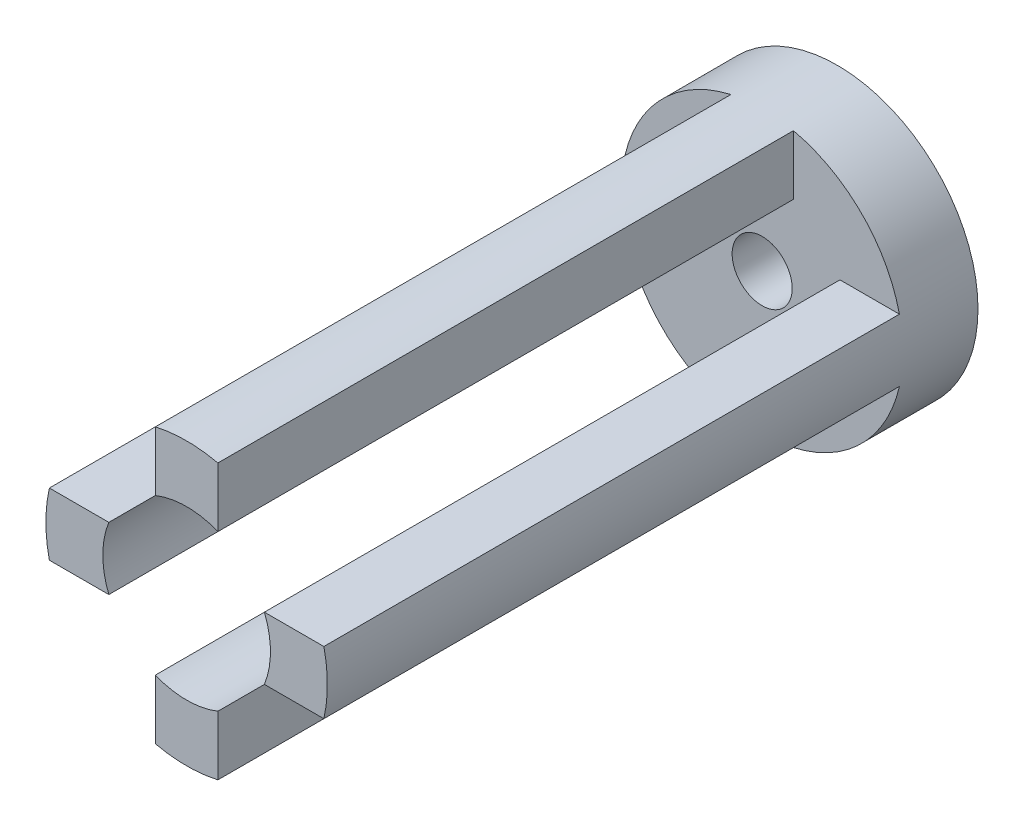
ISO-10303-21;
HEADER;
FILE_DESCRIPTION(('STEP AP214'),'2;1');
FILE_NAME('part.step','',(''),(''),'','','');
FILE_SCHEMA(('AUTOMOTIVE_DESIGN { 1 0 10303 214 1 1 1 1 }'));
ENDSEC;
DATA;
#1=APPLICATION_CONTEXT('core data for automotive mechanical design processes');
#2=APPLICATION_PROTOCOL_DEFINITION('international standard','automotive_design',2000,#1);
#3=PRODUCT_CONTEXT('',#1,'mechanical');
#4=PRODUCT('Part','Part','',(#3));
#5=PRODUCT_RELATED_PRODUCT_CATEGORY('part','',(#4));
#6=PRODUCT_DEFINITION_FORMATION('','',#4);
#7=PRODUCT_DEFINITION_CONTEXT('part definition',#1,'design');
#8=PRODUCT_DEFINITION('design','',#6,#7);
#9=PRODUCT_DEFINITION_SHAPE('','',#8);
#10=(LENGTH_UNIT() NAMED_UNIT(*) SI_UNIT(.MILLI.,.METRE.));
#11=(NAMED_UNIT(*) PLANE_ANGLE_UNIT() SI_UNIT($,.RADIAN.));
#12=(NAMED_UNIT(*) SI_UNIT($,.STERADIAN.) SOLID_ANGLE_UNIT());
#13=UNCERTAINTY_MEASURE_WITH_UNIT(LENGTH_MEASURE(1.E-05),#10,'distance_accuracy_value','');
#14=(GEOMETRIC_REPRESENTATION_CONTEXT(3) GLOBAL_UNCERTAINTY_ASSIGNED_CONTEXT((#13)) GLOBAL_UNIT_ASSIGNED_CONTEXT((#10,
#11,#12)) REPRESENTATION_CONTEXT('',''));
#15=CARTESIAN_POINT('',(0.,0.,0.));
#16=DIRECTION('',(0.,0.,1.));
#17=DIRECTION('',(1.,0.,0.));
#18=AXIS2_PLACEMENT_3D('',#15,#16,#17);
#19=CARTESIAN_POINT('',(0.,0.,6.));
#20=DIRECTION('',(0.,0.,1.));
#21=DIRECTION('',(1.,0.,0.));
#22=AXIS2_PLACEMENT_3D('',#19,#20,#21);
#23=PLANE('',#22);
#24=CARTESIAN_POINT('',(0.,0.,6.));
#25=DIRECTION('',(0.,0.,1.));
#26=DIRECTION('',(1.,0.,0.));
#27=AXIS2_PLACEMENT_3D('',#24,#25,#26);
#28=CIRCLE('',#27,2.4);
#29=CARTESIAN_POINT('',(2.4,0.,6.));
#30=VERTEX_POINT('',#29);
#31=EDGE_CURVE('E331',#30,#30,#28,.T.);
#32=ORIENTED_EDGE('',*,*,#31,.F.);
#33=EDGE_LOOP('',(#32));
#34=FACE_BOUND('',#33,.T.);
#35=CARTESIAN_POINT('',(0.,0.,6.));
#36=DIRECTION('',(0.,0.,1.));
#37=DIRECTION('',(1.,0.,0.));
#38=AXIS2_PLACEMENT_3D('',#35,#36,#37);
#39=CIRCLE('',#38,6.7);
#40=CARTESIAN_POINT('',(6.21610810716802,2.5,6.));
#41=VERTEX_POINT('',#40);
#42=CARTESIAN_POINT('',(6.21610810716802,-2.5,6.));
#43=VERTEX_POINT('',#42);
#44=EDGE_CURVE('E37',#41,#43,#39,.F.);
#45=ORIENTED_EDGE('',*,*,#44,.F.);
#46=DIRECTION('',(1.,0.,0.));
#47=VECTOR('',#46,1.);
#48=CARTESIAN_POINT('',(0.,2.5,6.));
#49=LINE('',#48,#47);
#50=CARTESIAN_POINT('',(10.9687054842401,2.5,6.));
#51=VERTEX_POINT('',#50);
#52=EDGE_CURVE('E209',#41,#51,#49,.T.);
#53=ORIENTED_EDGE('',*,*,#52,.T.);
#54=CARTESIAN_POINT('',(0.,0.,6.));
#55=DIRECTION('',(0.,0.,1.));
#56=DIRECTION('',(1.,0.,0.));
#57=AXIS2_PLACEMENT_3D('',#54,#55,#56);
#58=CIRCLE('',#57,11.25);
#59=CARTESIAN_POINT('',(2.5,10.9687054842401,6.));
#60=VERTEX_POINT('',#59);
#61=EDGE_CURVE('E333',#51,#60,#58,.T.);
#62=ORIENTED_EDGE('',*,*,#61,.T.);
#63=DIRECTION('',(0.,-1.,0.));
#64=VECTOR('',#63,1.);
#65=CARTESIAN_POINT('',(2.5,0.,6.));
#66=LINE('',#65,#64);
#67=CARTESIAN_POINT('',(2.5,6.21610810716802,6.));
#68=VERTEX_POINT('',#67);
#69=EDGE_CURVE('E25',#60,#68,#66,.T.);
#70=ORIENTED_EDGE('',*,*,#69,.T.);
#71=CARTESIAN_POINT('',(0.,0.,6.));
#72=DIRECTION('',(0.,0.,1.));
#73=DIRECTION('',(1.,0.,0.));
#74=AXIS2_PLACEMENT_3D('',#71,#72,#73);
#75=CIRCLE('',#74,6.7);
#76=CARTESIAN_POINT('',(-2.5,6.21610810716802,6.));
#77=VERTEX_POINT('',#76);
#78=EDGE_CURVE('E315',#77,#68,#75,.F.);
#79=ORIENTED_EDGE('',*,*,#78,.F.);
#80=DIRECTION('',(0.,-1.,0.));
#81=VECTOR('',#80,1.);
#82=CARTESIAN_POINT('',(-2.5,0.,6.));
#83=LINE('',#82,#81);
#84=CARTESIAN_POINT('',(-2.5,10.9687054842401,6.));
#85=VERTEX_POINT('',#84);
#86=EDGE_CURVE('E10',#85,#77,#83,.T.);
#87=ORIENTED_EDGE('',*,*,#86,.F.);
#88=CARTESIAN_POINT('',(-10.9687054842401,2.5,6.));
#89=VERTEX_POINT('',#88);
#90=EDGE_CURVE('E328',#85,#89,#58,.T.);
#91=ORIENTED_EDGE('',*,*,#90,.T.);
#92=DIRECTION('',(-1.,0.,0.));
#93=VECTOR('',#92,1.);
#94=CARTESIAN_POINT('',(0.,2.5,6.));
#95=LINE('',#94,#93);
#96=CARTESIAN_POINT('',(-6.21610810716802,2.5,6.));
#97=VERTEX_POINT('',#96);
#98=EDGE_CURVE('E289',#97,#89,#95,.T.);
#99=ORIENTED_EDGE('',*,*,#98,.F.);
#100=CARTESIAN_POINT('',(0.,0.,6.));
#101=DIRECTION('',(0.,0.,1.));
#102=DIRECTION('',(1.,0.,0.));
#103=AXIS2_PLACEMENT_3D('',#100,#101,#102);
#104=CIRCLE('',#103,6.7);
#105=CARTESIAN_POINT('',(-6.21610810716802,-2.5,6.));
#106=VERTEX_POINT('',#105);
#107=EDGE_CURVE('E285',#106,#97,#104,.F.);
#108=ORIENTED_EDGE('',*,*,#107,.F.);
#109=DIRECTION('',(-1.,0.,0.));
#110=VECTOR('',#109,1.);
#111=CARTESIAN_POINT('',(0.,-2.5,6.));
#112=LINE('',#111,#110);
#113=CARTESIAN_POINT('',(-10.9687054842401,-2.5,6.));
#114=VERTEX_POINT('',#113);
#115=EDGE_CURVE('E293',#106,#114,#112,.T.);
#116=ORIENTED_EDGE('',*,*,#115,.T.);
#117=CARTESIAN_POINT('',(-2.5,-10.9687054842401,6.));
#118=VERTEX_POINT('',#117);
#119=EDGE_CURVE('E332',#114,#118,#58,.T.);
#120=ORIENTED_EDGE('',*,*,#119,.T.);
#121=DIRECTION('',(0.,-1.,0.));
#122=VECTOR('',#121,1.);
#123=CARTESIAN_POINT('',(-2.5,0.,6.));
#124=LINE('',#123,#122);
#125=CARTESIAN_POINT('',(-2.5,-6.21610810716802,6.));
#126=VERTEX_POINT('',#125);
#127=EDGE_CURVE('E247',#126,#118,#124,.T.);
#128=ORIENTED_EDGE('',*,*,#127,.F.);
#129=CARTESIAN_POINT('',(0.,0.,6.));
#130=DIRECTION('',(0.,0.,1.));
#131=DIRECTION('',(1.,0.,0.));
#132=AXIS2_PLACEMENT_3D('',#129,#130,#131);
#133=CIRCLE('',#132,6.7);
#134=CARTESIAN_POINT('',(2.5,-6.21610810716802,6.));
#135=VERTEX_POINT('',#134);
#136=EDGE_CURVE('E232',#135,#126,#133,.F.);
#137=ORIENTED_EDGE('',*,*,#136,.F.);
#138=DIRECTION('',(0.,-1.,0.));
#139=VECTOR('',#138,1.);
#140=CARTESIAN_POINT('',(2.5,0.,6.));
#141=LINE('',#140,#139);
#142=CARTESIAN_POINT('',(2.5,-10.9687054842401,6.));
#143=VERTEX_POINT('',#142);
#144=EDGE_CURVE('E251',#135,#143,#141,.T.);
#145=ORIENTED_EDGE('',*,*,#144,.T.);
#146=CARTESIAN_POINT('',(10.9687054842401,-2.5,6.));
#147=VERTEX_POINT('',#146);
#148=EDGE_CURVE('E379',#143,#147,#58,.T.);
#149=ORIENTED_EDGE('',*,*,#148,.T.);
#150=DIRECTION('',(1.,0.,0.));
#151=VECTOR('',#150,1.);
#152=CARTESIAN_POINT('',(0.,-2.5,6.));
#153=LINE('',#152,#151);
#154=EDGE_CURVE('E46',#43,#147,#153,.T.);
#155=ORIENTED_EDGE('',*,*,#154,.F.);
#156=EDGE_LOOP('',(#45,#53,#62,#70,#79,#87,#91,#99,#108,#116,#120,#128,#137,#145,#149,#155));
#157=FACE_BOUND('',#156,.T.);
#158=ADVANCED_FACE('F16',(#34,#157),#23,.T.);
#159=CARTESIAN_POINT('',(0.,0.,6.));
#160=DIRECTION('',(0.,0.,-1.));
#161=DIRECTION('',(-1.,0.,0.));
#162=AXIS2_PLACEMENT_3D('',#159,#160,#161);
#163=CYLINDRICAL_SURFACE('',#162,11.25);
#164=CARTESIAN_POINT('',(0.,0.,0.));
#165=DIRECTION('',(0.,0.,1.));
#166=DIRECTION('',(1.,0.,0.));
#167=AXIS2_PLACEMENT_3D('',#164,#165,#166);
#168=CIRCLE('',#167,11.25);
#169=CARTESIAN_POINT('',(11.25,0.,0.));
#170=VERTEX_POINT('',#169);
#171=EDGE_CURVE('E327',#170,#170,#168,.T.);
#172=ORIENTED_EDGE('',*,*,#171,.T.);
#173=EDGE_LOOP('',(#172));
#174=FACE_BOUND('',#173,.T.);
#175=ORIENTED_EDGE('',*,*,#61,.F.);
#176=DIRECTION('',(0.,0.,-1.));
#177=VECTOR('',#176,1.);
#178=CARTESIAN_POINT('',(10.9687054842401,2.5,52.));
#179=LINE('',#178,#177);
#180=CARTESIAN_POINT('',(10.9687054842401,2.5,52.));
#181=VERTEX_POINT('',#180);
#182=EDGE_CURVE('E180',#181,#51,#179,.T.);
#183=ORIENTED_EDGE('',*,*,#182,.F.);
#184=CARTESIAN_POINT('',(0.,0.,52.));
#185=DIRECTION('',(0.,0.,1.));
#186=DIRECTION('',(1.,0.,0.));
#187=AXIS2_PLACEMENT_3D('',#184,#185,#186);
#188=CIRCLE('',#187,11.25);
#189=CARTESIAN_POINT('',(10.9687054842401,-2.5,52.));
#190=VERTEX_POINT('',#189);
#191=EDGE_CURVE('E174',#190,#181,#188,.T.);
#192=ORIENTED_EDGE('',*,*,#191,.F.);
#193=DIRECTION('',(0.,0.,-1.));
#194=VECTOR('',#193,1.);
#195=CARTESIAN_POINT('',(10.9687054842401,-2.5,52.));
#196=LINE('',#195,#194);
#197=EDGE_CURVE('E164',#190,#147,#196,.T.);
#198=ORIENTED_EDGE('',*,*,#197,.T.);
#199=ORIENTED_EDGE('',*,*,#148,.F.);
#200=DIRECTION('',(0.,0.,-1.));
#201=VECTOR('',#200,1.);
#202=CARTESIAN_POINT('',(2.5,-10.9687054842401,52.));
#203=LINE('',#202,#201);
#204=CARTESIAN_POINT('',(2.5,-10.9687054842401,52.));
#205=VERTEX_POINT('',#204);
#206=EDGE_CURVE('E228',#205,#143,#203,.T.);
#207=ORIENTED_EDGE('',*,*,#206,.F.);
#208=CARTESIAN_POINT('',(0.,0.,52.));
#209=DIRECTION('',(0.,0.,1.));
#210=DIRECTION('',(1.,0.,0.));
#211=AXIS2_PLACEMENT_3D('',#208,#209,#210);
#212=CIRCLE('',#211,11.25);
#213=CARTESIAN_POINT('',(-2.5,-10.9687054842401,52.));
#214=VERTEX_POINT('',#213);
#215=EDGE_CURVE('E220',#214,#205,#212,.T.);
#216=ORIENTED_EDGE('',*,*,#215,.F.);
#217=DIRECTION('',(0.,0.,-1.));
#218=VECTOR('',#217,1.);
#219=CARTESIAN_POINT('',(-2.5,-10.9687054842401,52.));
#220=LINE('',#219,#218);
#221=EDGE_CURVE('E227',#214,#118,#220,.T.);
#222=ORIENTED_EDGE('',*,*,#221,.T.);
#223=ORIENTED_EDGE('',*,*,#119,.F.);
#224=DIRECTION('',(0.,0.,-1.));
#225=VECTOR('',#224,1.);
#226=CARTESIAN_POINT('',(-10.9687054842401,-2.5,52.));
#227=LINE('',#226,#225);
#228=CARTESIAN_POINT('',(-10.9687054842401,-2.5,52.));
#229=VERTEX_POINT('',#228);
#230=EDGE_CURVE('E281',#229,#114,#227,.T.);
#231=ORIENTED_EDGE('',*,*,#230,.F.);
#232=CARTESIAN_POINT('',(0.,0.,52.));
#233=DIRECTION('',(0.,0.,1.));
#234=DIRECTION('',(1.,0.,0.));
#235=AXIS2_PLACEMENT_3D('',#232,#233,#234);
#236=CIRCLE('',#235,11.25);
#237=CARTESIAN_POINT('',(-10.9687054842401,2.5,52.));
#238=VERTEX_POINT('',#237);
#239=EDGE_CURVE('E254',#238,#229,#236,.T.);
#240=ORIENTED_EDGE('',*,*,#239,.F.);
#241=DIRECTION('',(0.,0.,-1.));
#242=VECTOR('',#241,1.);
#243=CARTESIAN_POINT('',(-10.9687054842401,2.5,52.));
#244=LINE('',#243,#242);
#245=EDGE_CURVE('E269',#238,#89,#244,.T.);
#246=ORIENTED_EDGE('',*,*,#245,.T.);
#247=ORIENTED_EDGE('',*,*,#90,.F.);
#248=DIRECTION('',(0.,0.,-1.));
#249=VECTOR('',#248,1.);
#250=CARTESIAN_POINT('',(-2.5,10.9687054842401,52.));
#251=LINE('',#250,#249);
#252=CARTESIAN_POINT('',(-2.5,10.9687054842401,52.));
#253=VERTEX_POINT('',#252);
#254=EDGE_CURVE('E305',#253,#85,#251,.T.);
#255=ORIENTED_EDGE('',*,*,#254,.F.);
#256=CARTESIAN_POINT('',(0.,0.,52.));
#257=DIRECTION('',(0.,0.,1.));
#258=DIRECTION('',(1.,0.,0.));
#259=AXIS2_PLACEMENT_3D('',#256,#257,#258);
#260=CIRCLE('',#259,11.25);
#261=CARTESIAN_POINT('',(2.5,10.9687054842401,52.));
#262=VERTEX_POINT('',#261);
#263=EDGE_CURVE('E296',#262,#253,#260,.T.);
#264=ORIENTED_EDGE('',*,*,#263,.F.);
#265=DIRECTION('',(0.,0.,-1.));
#266=VECTOR('',#265,1.);
#267=CARTESIAN_POINT('',(2.5,10.9687054842401,52.));
#268=LINE('',#267,#266);
#269=EDGE_CURVE('E319',#262,#60,#268,.T.);
#270=ORIENTED_EDGE('',*,*,#269,.T.);
#271=EDGE_LOOP('',(#175,#183,#192,#198,#199,#207,#216,#222,#223,#231,#240,#246,#247,#255,#264,#270));
#272=FACE_BOUND('',#271,.T.);
#273=ADVANCED_FACE('F18',(#174,#272),#163,.T.);
#274=CARTESIAN_POINT('',(0.,0.,6.));
#275=DIRECTION('',(0.,0.,-1.));
#276=DIRECTION('',(-1.,0.,0.));
#277=AXIS2_PLACEMENT_3D('',#274,#275,#276);
#278=CYLINDRICAL_SURFACE('',#277,2.4);
#279=ORIENTED_EDGE('',*,*,#31,.T.);
#280=EDGE_LOOP('',(#279));
#281=FACE_BOUND('',#280,.T.);
#282=CARTESIAN_POINT('',(0.,0.,0.));
#283=DIRECTION('',(0.,0.,1.));
#284=DIRECTION('',(1.,0.,0.));
#285=AXIS2_PLACEMENT_3D('',#282,#283,#284);
#286=CIRCLE('',#285,2.4);
#287=CARTESIAN_POINT('',(2.4,0.,0.));
#288=VERTEX_POINT('',#287);
#289=EDGE_CURVE('E340',#288,#288,#286,.T.);
#290=ORIENTED_EDGE('',*,*,#289,.F.);
#291=EDGE_LOOP('',(#290));
#292=FACE_BOUND('',#291,.T.);
#293=ADVANCED_FACE('F423',(#281,#292),#278,.F.);
#294=CARTESIAN_POINT('',(0.,0.,0.));
#295=DIRECTION('',(0.,0.,1.));
#296=DIRECTION('',(1.,0.,0.));
#297=AXIS2_PLACEMENT_3D('',#294,#295,#296);
#298=PLANE('',#297);
#299=ORIENTED_EDGE('',*,*,#171,.F.);
#300=EDGE_LOOP('',(#299));
#301=FACE_BOUND('',#300,.T.);
#302=ORIENTED_EDGE('',*,*,#289,.T.);
#303=EDGE_LOOP('',(#302));
#304=FACE_BOUND('',#303,.T.);
#305=ADVANCED_FACE('F429',(#301,#304),#298,.F.);
#306=CARTESIAN_POINT('',(-2.5,9.21122622266412,52.));
#307=DIRECTION('',(-1.,0.,0.));
#308=DIRECTION('',(0.,-1.,0.));
#309=AXIS2_PLACEMENT_3D('',#306,#307,#308);
#310=PLANE('',#309);
#311=ORIENTED_EDGE('',*,*,#254,.T.);
#312=ORIENTED_EDGE('',*,*,#86,.T.);
#313=DIRECTION('',(0.,0.,-1.));
#314=VECTOR('',#313,1.);
#315=CARTESIAN_POINT('',(-2.5,6.21610810716802,52.));
#316=LINE('',#315,#314);
#317=CARTESIAN_POINT('',(-2.5,6.21610810716802,52.));
#318=VERTEX_POINT('',#317);
#319=EDGE_CURVE('E311',#318,#77,#316,.T.);
#320=ORIENTED_EDGE('',*,*,#319,.F.);
#321=DIRECTION('',(0.,1.,0.));
#322=VECTOR('',#321,1.);
#323=CARTESIAN_POINT('',(-2.5,9.21122622266412,52.));
#324=LINE('',#323,#322);
#325=EDGE_CURVE('E301',#318,#253,#324,.T.);
#326=ORIENTED_EDGE('',*,*,#325,.T.);
#327=EDGE_LOOP('',(#311,#312,#320,#326));
#328=FACE_BOUND('',#327,.T.);
#329=ADVANCED_FACE('F363',(#328),#310,.T.);
#330=CARTESIAN_POINT('',(0.,0.,52.));
#331=DIRECTION('',(0.,0.,-1.));
#332=DIRECTION('',(-1.,0.,0.));
#333=AXIS2_PLACEMENT_3D('',#330,#331,#332);
#334=CYLINDRICAL_SURFACE('',#333,6.7);
#335=ORIENTED_EDGE('',*,*,#319,.T.);
#336=ORIENTED_EDGE('',*,*,#78,.T.);
#337=DIRECTION('',(0.,0.,-1.));
#338=VECTOR('',#337,1.);
#339=CARTESIAN_POINT('',(2.5,6.21610810716802,52.));
#340=LINE('',#339,#338);
#341=CARTESIAN_POINT('',(2.5,6.21610810716802,52.));
#342=VERTEX_POINT('',#341);
#343=EDGE_CURVE('E316',#342,#68,#340,.T.);
#344=ORIENTED_EDGE('',*,*,#343,.F.);
#345=CARTESIAN_POINT('',(0.,0.,52.));
#346=DIRECTION('',(0.,0.,1.));
#347=DIRECTION('',(1.,0.,0.));
#348=AXIS2_PLACEMENT_3D('',#345,#346,#347);
#349=CIRCLE('',#348,6.7);
#350=EDGE_CURVE('E300',#342,#318,#349,.T.);
#351=ORIENTED_EDGE('',*,*,#350,.T.);
#352=EDGE_LOOP('',(#335,#336,#344,#351));
#353=FACE_BOUND('',#352,.T.);
#354=ADVANCED_FACE('F361',(#353),#334,.F.);
#355=CARTESIAN_POINT('',(2.5,9.21122622266412,52.));
#356=DIRECTION('',(-1.,0.,0.));
#357=DIRECTION('',(0.,-1.,0.));
#358=AXIS2_PLACEMENT_3D('',#355,#356,#357);
#359=PLANE('',#358);
#360=ORIENTED_EDGE('',*,*,#69,.F.);
#361=ORIENTED_EDGE('',*,*,#269,.F.);
#362=DIRECTION('',(0.,1.,0.));
#363=VECTOR('',#362,1.);
#364=CARTESIAN_POINT('',(2.5,9.21122622266412,52.));
#365=LINE('',#364,#363);
#366=EDGE_CURVE('E297',#342,#262,#365,.T.);
#367=ORIENTED_EDGE('',*,*,#366,.F.);
#368=ORIENTED_EDGE('',*,*,#343,.T.);
#369=EDGE_LOOP('',(#360,#361,#367,#368));
#370=FACE_BOUND('',#369,.T.);
#371=ADVANCED_FACE('F351',(#370),#359,.F.);
#372=CARTESIAN_POINT('',(-0.212405808269977,-0.132150643318892,52.));
#373=DIRECTION('',(0.,0.,1.));
#374=DIRECTION('',(1.,0.,0.));
#375=AXIS2_PLACEMENT_3D('',#372,#373,#374);
#376=PLANE('',#375);
#377=ORIENTED_EDGE('',*,*,#325,.F.);
#378=ORIENTED_EDGE('',*,*,#350,.F.);
#379=ORIENTED_EDGE('',*,*,#366,.T.);
#380=ORIENTED_EDGE('',*,*,#263,.T.);
#381=EDGE_LOOP('',(#377,#378,#379,#380));
#382=FACE_BOUND('',#381,.T.);
#383=ADVANCED_FACE('F358',(#382),#376,.T.);
#384=CARTESIAN_POINT('',(-9.14434809237719,-2.5,52.));
#385=DIRECTION('',(0.,1.,0.));
#386=DIRECTION('',(-1.,0.,0.));
#387=AXIS2_PLACEMENT_3D('',#384,#385,#386);
#388=PLANE('',#387);
#389=ORIENTED_EDGE('',*,*,#115,.F.);
#390=DIRECTION('',(0.,0.,-1.));
#391=VECTOR('',#390,1.);
#392=CARTESIAN_POINT('',(-6.21610810716802,-2.5,52.));
#393=LINE('',#392,#391);
#394=CARTESIAN_POINT('',(-6.21610810716802,-2.5,52.));
#395=VERTEX_POINT('',#394);
#396=EDGE_CURVE('E277',#395,#106,#393,.T.);
#397=ORIENTED_EDGE('',*,*,#396,.F.);
#398=DIRECTION('',(1.,0.,0.));
#399=VECTOR('',#398,1.);
#400=CARTESIAN_POINT('',(-9.14434809237719,-2.5,52.));
#401=LINE('',#400,#399);
#402=EDGE_CURVE('E258',#229,#395,#401,.T.);
#403=ORIENTED_EDGE('',*,*,#402,.F.);
#404=ORIENTED_EDGE('',*,*,#230,.T.);
#405=EDGE_LOOP('',(#389,#397,#403,#404));
#406=FACE_BOUND('',#405,.T.);
#407=ADVANCED_FACE('F375',(#406),#388,.F.);
#408=CARTESIAN_POINT('',(0.,0.,52.));
#409=DIRECTION('',(0.,0.,-1.));
#410=DIRECTION('',(-1.,0.,0.));
#411=AXIS2_PLACEMENT_3D('',#408,#409,#410);
#412=CYLINDRICAL_SURFACE('',#411,6.7);
#413=ORIENTED_EDGE('',*,*,#396,.T.);
#414=ORIENTED_EDGE('',*,*,#107,.T.);
#415=DIRECTION('',(0.,0.,-1.));
#416=VECTOR('',#415,1.);
#417=CARTESIAN_POINT('',(-6.21610810716802,2.5,52.));
#418=LINE('',#417,#416);
#419=CARTESIAN_POINT('',(-6.21610810716802,2.5,52.));
#420=VERTEX_POINT('',#419);
#421=EDGE_CURVE('E273',#420,#97,#418,.T.);
#422=ORIENTED_EDGE('',*,*,#421,.F.);
#423=CARTESIAN_POINT('',(0.,0.,52.));
#424=DIRECTION('',(0.,0.,1.));
#425=DIRECTION('',(1.,0.,0.));
#426=AXIS2_PLACEMENT_3D('',#423,#424,#425);
#427=CIRCLE('',#426,6.7);
#428=EDGE_CURVE('E259',#420,#395,#427,.T.);
#429=ORIENTED_EDGE('',*,*,#428,.T.);
#430=EDGE_LOOP('',(#413,#414,#422,#429));
#431=FACE_BOUND('',#430,.T.);
#432=ADVANCED_FACE('F371',(#431),#412,.F.);
#433=CARTESIAN_POINT('',(-9.14434809237719,2.5,52.));
#434=DIRECTION('',(0.,1.,0.));
#435=DIRECTION('',(0.,0.,1.));
#436=AXIS2_PLACEMENT_3D('',#433,#434,#435);
#437=PLANE('',#436);
#438=ORIENTED_EDGE('',*,*,#421,.T.);
#439=ORIENTED_EDGE('',*,*,#98,.T.);
#440=ORIENTED_EDGE('',*,*,#245,.F.);
#441=DIRECTION('',(1.,0.,0.));
#442=VECTOR('',#441,1.);
#443=CARTESIAN_POINT('',(-9.14434809237719,2.5,52.));
#444=LINE('',#443,#442);
#445=EDGE_CURVE('E263',#238,#420,#444,.T.);
#446=ORIENTED_EDGE('',*,*,#445,.T.);
#447=EDGE_LOOP('',(#438,#439,#440,#446));
#448=FACE_BOUND('',#447,.T.);
#449=ADVANCED_FACE('F368',(#448),#437,.T.);
#450=CARTESIAN_POINT('',(-0.212405808269977,-0.132150643318892,52.));
#451=DIRECTION('',(0.,0.,1.));
#452=DIRECTION('',(1.,0.,0.));
#453=AXIS2_PLACEMENT_3D('',#450,#451,#452);
#454=PLANE('',#453);
#455=ORIENTED_EDGE('',*,*,#239,.T.);
#456=ORIENTED_EDGE('',*,*,#402,.T.);
#457=ORIENTED_EDGE('',*,*,#428,.F.);
#458=ORIENTED_EDGE('',*,*,#445,.F.);
#459=EDGE_LOOP('',(#455,#456,#457,#458));
#460=FACE_BOUND('',#459,.T.);
#461=ADVANCED_FACE('F415',(#460),#454,.T.);
#462=CARTESIAN_POINT('',(2.5,-9.07130260020494,52.));
#463=DIRECTION('',(-1.,0.,0.));
#464=DIRECTION('',(0.,-1.,0.));
#465=AXIS2_PLACEMENT_3D('',#462,#463,#464);
#466=PLANE('',#465);
#467=ORIENTED_EDGE('',*,*,#144,.F.);
#468=DIRECTION('',(0.,0.,-1.));
#469=VECTOR('',#468,1.);
#470=CARTESIAN_POINT('',(2.5,-6.21610810716802,52.));
#471=LINE('',#470,#469);
#472=CARTESIAN_POINT('',(2.5,-6.21610810716802,52.));
#473=VERTEX_POINT('',#472);
#474=EDGE_CURVE('E233',#473,#135,#471,.T.);
#475=ORIENTED_EDGE('',*,*,#474,.F.);
#476=DIRECTION('',(0.,1.,0.));
#477=VECTOR('',#476,1.);
#478=CARTESIAN_POINT('',(2.5,-9.07130260020494,52.));
#479=LINE('',#478,#477);
#480=EDGE_CURVE('E217',#205,#473,#479,.T.);
#481=ORIENTED_EDGE('',*,*,#480,.F.);
#482=ORIENTED_EDGE('',*,*,#206,.T.);
#483=EDGE_LOOP('',(#467,#475,#481,#482));
#484=FACE_BOUND('',#483,.T.);
#485=ADVANCED_FACE('F397',(#484),#466,.F.);
#486=CARTESIAN_POINT('',(0.,0.,52.));
#487=DIRECTION('',(0.,0.,-1.));
#488=DIRECTION('',(-1.,0.,0.));
#489=AXIS2_PLACEMENT_3D('',#486,#487,#488);
#490=CYLINDRICAL_SURFACE('',#489,6.7);
#491=ORIENTED_EDGE('',*,*,#474,.T.);
#492=ORIENTED_EDGE('',*,*,#136,.T.);
#493=DIRECTION('',(0.,0.,-1.));
#494=VECTOR('',#493,1.);
#495=CARTESIAN_POINT('',(-2.5,-6.21610810716802,52.));
#496=LINE('',#495,#494);
#497=CARTESIAN_POINT('',(-2.5,-6.21610810716802,52.));
#498=VERTEX_POINT('',#497);
#499=EDGE_CURVE('E237',#498,#126,#496,.T.);
#500=ORIENTED_EDGE('',*,*,#499,.F.);
#501=CARTESIAN_POINT('',(0.,0.,52.));
#502=DIRECTION('',(0.,0.,1.));
#503=DIRECTION('',(1.,0.,0.));
#504=AXIS2_PLACEMENT_3D('',#501,#502,#503);
#505=CIRCLE('',#504,6.7);
#506=EDGE_CURVE('E216',#498,#473,#505,.T.);
#507=ORIENTED_EDGE('',*,*,#506,.T.);
#508=EDGE_LOOP('',(#491,#492,#500,#507));
#509=FACE_BOUND('',#508,.T.);
#510=ADVANCED_FACE('F406',(#509),#490,.F.);
#511=CARTESIAN_POINT('',(-2.5,-9.07130260020494,52.));
#512=DIRECTION('',(-1.,0.,0.));
#513=DIRECTION('',(0.,-1.,0.));
#514=AXIS2_PLACEMENT_3D('',#511,#512,#513);
#515=PLANE('',#514);
#516=ORIENTED_EDGE('',*,*,#499,.T.);
#517=ORIENTED_EDGE('',*,*,#127,.T.);
#518=ORIENTED_EDGE('',*,*,#221,.F.);
#519=DIRECTION('',(0.,1.,0.));
#520=VECTOR('',#519,1.);
#521=CARTESIAN_POINT('',(-2.5,-9.07130260020494,52.));
#522=LINE('',#521,#520);
#523=EDGE_CURVE('E212',#214,#498,#522,.T.);
#524=ORIENTED_EDGE('',*,*,#523,.T.);
#525=EDGE_LOOP('',(#516,#517,#518,#524));
#526=FACE_BOUND('',#525,.T.);
#527=ADVANCED_FACE('F404',(#526),#515,.T.);
#528=CARTESIAN_POINT('',(-0.212405808269977,-0.132150643318892,52.));
#529=DIRECTION('',(0.,0.,1.));
#530=DIRECTION('',(1.,0.,0.));
#531=AXIS2_PLACEMENT_3D('',#528,#529,#530);
#532=PLANE('',#531);
#533=ORIENTED_EDGE('',*,*,#215,.T.);
#534=ORIENTED_EDGE('',*,*,#480,.T.);
#535=ORIENTED_EDGE('',*,*,#506,.F.);
#536=ORIENTED_EDGE('',*,*,#523,.F.);
#537=EDGE_LOOP('',(#533,#534,#535,#536));
#538=FACE_BOUND('',#537,.T.);
#539=ADVANCED_FACE('F402',(#538),#532,.T.);
#540=CARTESIAN_POINT('',(9.20673366636038,2.5,52.));
#541=DIRECTION('',(0.,-1.,0.));
#542=DIRECTION('',(0.,0.,-1.));
#543=AXIS2_PLACEMENT_3D('',#540,#541,#542);
#544=PLANE('',#543);
#545=ORIENTED_EDGE('',*,*,#52,.F.);
#546=DIRECTION('',(0.,0.,-1.));
#547=VECTOR('',#546,1.);
#548=CARTESIAN_POINT('',(6.21610810716802,2.5,52.));
#549=LINE('',#548,#547);
#550=CARTESIAN_POINT('',(6.21610810716802,2.5,52.));
#551=VERTEX_POINT('',#550);
#552=EDGE_CURVE('E199',#551,#41,#549,.T.);
#553=ORIENTED_EDGE('',*,*,#552,.F.);
#554=DIRECTION('',(-1.,0.,0.));
#555=VECTOR('',#554,1.);
#556=CARTESIAN_POINT('',(9.20673366636038,2.5,52.));
#557=LINE('',#556,#555);
#558=EDGE_CURVE('E183',#181,#551,#557,.T.);
#559=ORIENTED_EDGE('',*,*,#558,.F.);
#560=ORIENTED_EDGE('',*,*,#182,.T.);
#561=EDGE_LOOP('',(#545,#553,#559,#560));
#562=FACE_BOUND('',#561,.T.);
#563=ADVANCED_FACE('F494',(#562),#544,.F.);
#564=CARTESIAN_POINT('',(0.,0.,52.));
#565=DIRECTION('',(0.,0.,-1.));
#566=DIRECTION('',(-1.,0.,0.));
#567=AXIS2_PLACEMENT_3D('',#564,#565,#566);
#568=CYLINDRICAL_SURFACE('',#567,6.7);
#569=ORIENTED_EDGE('',*,*,#552,.T.);
#570=ORIENTED_EDGE('',*,*,#44,.T.);
#571=DIRECTION('',(0.,0.,-1.));
#572=VECTOR('',#571,1.);
#573=CARTESIAN_POINT('',(6.21610810716802,-2.5,52.));
#574=LINE('',#573,#572);
#575=CARTESIAN_POINT('',(6.21610810716802,-2.5,52.));
#576=VERTEX_POINT('',#575);
#577=EDGE_CURVE('E173',#576,#43,#574,.T.);
#578=ORIENTED_EDGE('',*,*,#577,.F.);
#579=CARTESIAN_POINT('',(0.,0.,52.));
#580=DIRECTION('',(0.,0.,1.));
#581=DIRECTION('',(1.,0.,0.));
#582=AXIS2_PLACEMENT_3D('',#579,#580,#581);
#583=CIRCLE('',#582,6.7);
#584=EDGE_CURVE('E188',#576,#551,#583,.T.);
#585=ORIENTED_EDGE('',*,*,#584,.T.);
#586=EDGE_LOOP('',(#569,#570,#578,#585));
#587=FACE_BOUND('',#586,.T.);
#588=ADVANCED_FACE('F498',(#587),#568,.F.);
#589=CARTESIAN_POINT('',(9.20673366636038,-2.5,52.));
#590=DIRECTION('',(0.,-1.,0.));
#591=DIRECTION('',(0.,0.,-1.));
#592=AXIS2_PLACEMENT_3D('',#589,#590,#591);
#593=PLANE('',#592);
#594=ORIENTED_EDGE('',*,*,#577,.T.);
#595=ORIENTED_EDGE('',*,*,#154,.T.);
#596=ORIENTED_EDGE('',*,*,#197,.F.);
#597=DIRECTION('',(-1.,0.,0.));
#598=VECTOR('',#597,1.);
#599=CARTESIAN_POINT('',(9.20673366636038,-2.5,52.));
#600=LINE('',#599,#598);
#601=EDGE_CURVE('E169',#190,#576,#600,.T.);
#602=ORIENTED_EDGE('',*,*,#601,.T.);
#603=EDGE_LOOP('',(#594,#595,#596,#602));
#604=FACE_BOUND('',#603,.T.);
#605=ADVANCED_FACE('F167',(#604),#593,.T.);
#606=CARTESIAN_POINT('',(-0.212405808269977,-0.132150643318892,52.));
#607=DIRECTION('',(0.,0.,1.));
#608=DIRECTION('',(1.,0.,0.));
#609=AXIS2_PLACEMENT_3D('',#606,#607,#608);
#610=PLANE('',#609);
#611=ORIENTED_EDGE('',*,*,#191,.T.);
#612=ORIENTED_EDGE('',*,*,#558,.T.);
#613=ORIENTED_EDGE('',*,*,#584,.F.);
#614=ORIENTED_EDGE('',*,*,#601,.F.);
#615=EDGE_LOOP('',(#611,#612,#613,#614));
#616=FACE_BOUND('',#615,.T.);
#617=ADVANCED_FACE('F186',(#616),#610,.T.);
#618=CLOSED_SHELL('',(#158,#273,#293,#305,#329,#354,#371,#383,#407,#432,#449,#461,#485,#510,
#527,#539,#563,#588,#605,#617));
#619=MANIFOLD_SOLID_BREP('B1',#618);
#620=ADVANCED_BREP_SHAPE_REPRESENTATION('',(#18,#619),#14);
#621=SHAPE_DEFINITION_REPRESENTATION(#9,#620);
ENDSEC;
END-ISO-10303-21;
